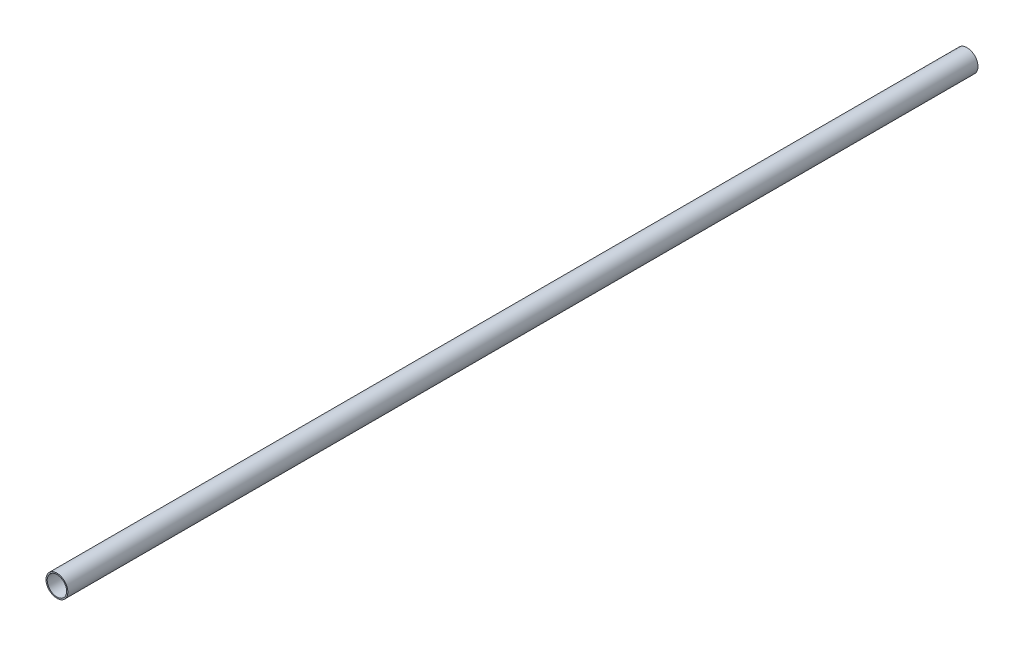
ISO-10303-21;
HEADER;
FILE_DESCRIPTION(('STEP AP214'),'2;1');
FILE_NAME('part.step','',(''),(''),'','','');
FILE_SCHEMA(('AUTOMOTIVE_DESIGN { 1 0 10303 214 1 1 1 1 }'));
ENDSEC;
DATA;
#1=APPLICATION_CONTEXT('core data for automotive mechanical design processes');
#2=APPLICATION_PROTOCOL_DEFINITION('international standard','automotive_design',2000,#1);
#3=PRODUCT_CONTEXT('',#1,'mechanical');
#4=PRODUCT('Part','Part','',(#3));
#5=PRODUCT_RELATED_PRODUCT_CATEGORY('part','',(#4));
#6=PRODUCT_DEFINITION_FORMATION('','',#4);
#7=PRODUCT_DEFINITION_CONTEXT('part definition',#1,'design');
#8=PRODUCT_DEFINITION('design','',#6,#7);
#9=PRODUCT_DEFINITION_SHAPE('','',#8);
#10=(LENGTH_UNIT() NAMED_UNIT(*) SI_UNIT(.MILLI.,.METRE.));
#11=(NAMED_UNIT(*) PLANE_ANGLE_UNIT() SI_UNIT($,.RADIAN.));
#12=(NAMED_UNIT(*) SI_UNIT($,.STERADIAN.) SOLID_ANGLE_UNIT());
#13=UNCERTAINTY_MEASURE_WITH_UNIT(LENGTH_MEASURE(1.E-05),#10,'distance_accuracy_value','');
#14=(GEOMETRIC_REPRESENTATION_CONTEXT(3) GLOBAL_UNCERTAINTY_ASSIGNED_CONTEXT((#13)) GLOBAL_UNIT_ASSIGNED_CONTEXT((#10,
#11,#12)) REPRESENTATION_CONTEXT('',''));
#15=CARTESIAN_POINT('',(0.,0.,0.));
#16=DIRECTION('',(0.,0.,1.));
#17=DIRECTION('',(1.,0.,0.));
#18=AXIS2_PLACEMENT_3D('',#15,#16,#17);
#19=CARTESIAN_POINT('',(0.,0.,330.2));
#20=DIRECTION('',(0.,0.,1.));
#21=DIRECTION('',(1.,0.,0.));
#22=AXIS2_PLACEMENT_3D('',#19,#20,#21);
#23=PLANE('',#22);
#24=CARTESIAN_POINT('',(0.,0.,330.2));
#25=DIRECTION('',(0.,0.,1.));
#26=DIRECTION('',(1.,0.,0.));
#27=AXIS2_PLACEMENT_3D('',#24,#25,#26);
#28=CIRCLE('',#27,7.9375);
#29=CARTESIAN_POINT('',(7.9375,0.,330.2));
#30=VERTEX_POINT('',#29);
#31=EDGE_CURVE('E10',#30,#30,#28,.T.);
#32=ORIENTED_EDGE('',*,*,#31,.T.);
#33=EDGE_LOOP('',(#32));
#34=FACE_BOUND('',#33,.T.);
#35=CARTESIAN_POINT('',(0.,0.,330.2));
#36=DIRECTION('',(0.,0.,1.));
#37=DIRECTION('',(1.,0.,0.));
#38=AXIS2_PLACEMENT_3D('',#35,#36,#37);
#39=CIRCLE('',#38,7.0485);
#40=CARTESIAN_POINT('',(7.0485,0.,330.2));
#41=VERTEX_POINT('',#40);
#42=EDGE_CURVE('E56',#41,#41,#39,.T.);
#43=ORIENTED_EDGE('',*,*,#42,.F.);
#44=EDGE_LOOP('',(#43));
#45=FACE_BOUND('',#44,.T.);
#46=ADVANCED_FACE('F43',(#34,#45),#23,.T.);
#47=CARTESIAN_POINT('',(0.,0.,-330.2));
#48=DIRECTION('',(0.,0.,1.));
#49=DIRECTION('',(1.,0.,0.));
#50=AXIS2_PLACEMENT_3D('',#47,#48,#49);
#51=PLANE('',#50);
#52=CARTESIAN_POINT('',(0.,0.,-330.2));
#53=DIRECTION('',(0.,0.,1.));
#54=DIRECTION('',(1.,0.,0.));
#55=AXIS2_PLACEMENT_3D('',#52,#53,#54);
#56=CIRCLE('',#55,7.9375);
#57=CARTESIAN_POINT('',(7.9375,0.,-330.2));
#58=VERTEX_POINT('',#57);
#59=EDGE_CURVE('E47',#58,#58,#56,.T.);
#60=ORIENTED_EDGE('',*,*,#59,.F.);
#61=EDGE_LOOP('',(#60));
#62=FACE_BOUND('',#61,.T.);
#63=CARTESIAN_POINT('',(0.,0.,-330.2));
#64=DIRECTION('',(0.,0.,1.));
#65=DIRECTION('',(1.,0.,0.));
#66=AXIS2_PLACEMENT_3D('',#63,#64,#65);
#67=CIRCLE('',#66,7.0485);
#68=CARTESIAN_POINT('',(7.0485,0.,-330.2));
#69=VERTEX_POINT('',#68);
#70=EDGE_CURVE('E58',#69,#69,#67,.T.);
#71=ORIENTED_EDGE('',*,*,#70,.T.);
#72=EDGE_LOOP('',(#71));
#73=FACE_BOUND('',#72,.T.);
#74=ADVANCED_FACE('F70',(#62,#73),#51,.F.);
#75=CARTESIAN_POINT('',(0.,0.,330.2));
#76=DIRECTION('',(0.,0.,-1.));
#77=DIRECTION('',(-1.,0.,0.));
#78=AXIS2_PLACEMENT_3D('',#75,#76,#77);
#79=CYLINDRICAL_SURFACE('',#78,7.9375);
#80=ORIENTED_EDGE('',*,*,#31,.F.);
#81=EDGE_LOOP('',(#80));
#82=FACE_BOUND('',#81,.T.);
#83=ORIENTED_EDGE('',*,*,#59,.T.);
#84=EDGE_LOOP('',(#83));
#85=FACE_BOUND('',#84,.T.);
#86=ADVANCED_FACE('F45',(#82,#85),#79,.T.);
#87=CARTESIAN_POINT('',(0.,0.,330.2));
#88=DIRECTION('',(0.,0.,-1.));
#89=DIRECTION('',(-1.,0.,0.));
#90=AXIS2_PLACEMENT_3D('',#87,#88,#89);
#91=CYLINDRICAL_SURFACE('',#90,7.0485);
#92=ORIENTED_EDGE('',*,*,#42,.T.);
#93=EDGE_LOOP('',(#92));
#94=FACE_BOUND('',#93,.T.);
#95=ORIENTED_EDGE('',*,*,#70,.F.);
#96=EDGE_LOOP('',(#95));
#97=FACE_BOUND('',#96,.T.);
#98=ADVANCED_FACE('F66',(#94,#97),#91,.F.);
#99=CLOSED_SHELL('',(#46,#74,#86,#98));
#100=MANIFOLD_SOLID_BREP('B2',#99);
#101=ADVANCED_BREP_SHAPE_REPRESENTATION('',(#18,#100),#14);
#102=SHAPE_DEFINITION_REPRESENTATION(#9,#101);
ENDSEC;
END-ISO-10303-21;
